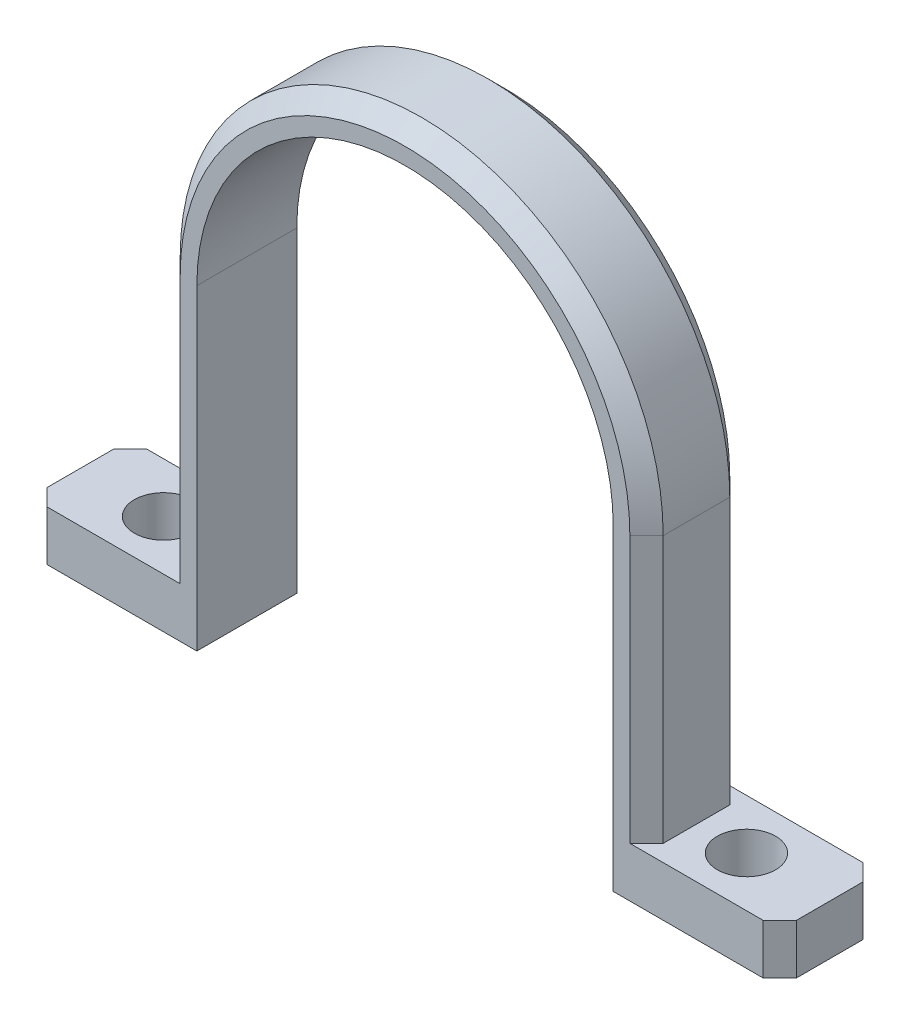
ISO-10303-21;
HEADER;
FILE_DESCRIPTION(('STEP AP214'),'2;1');
FILE_NAME('part.step','',(''),(''),'','','');
FILE_SCHEMA(('AUTOMOTIVE_DESIGN { 1 0 10303 214 1 1 1 1 }'));
ENDSEC;
DATA;
#1=APPLICATION_CONTEXT('core data for automotive mechanical design processes');
#2=APPLICATION_PROTOCOL_DEFINITION('international standard','automotive_design',2000,#1);
#3=PRODUCT_CONTEXT('',#1,'mechanical');
#4=PRODUCT('Part','Part','',(#3));
#5=PRODUCT_RELATED_PRODUCT_CATEGORY('part','',(#4));
#6=PRODUCT_DEFINITION_FORMATION('','',#4);
#7=PRODUCT_DEFINITION_CONTEXT('part definition',#1,'design');
#8=PRODUCT_DEFINITION('design','',#6,#7);
#9=PRODUCT_DEFINITION_SHAPE('','',#8);
#10=(LENGTH_UNIT() NAMED_UNIT(*) SI_UNIT(.MILLI.,.METRE.));
#11=(NAMED_UNIT(*) PLANE_ANGLE_UNIT() SI_UNIT($,.RADIAN.));
#12=(NAMED_UNIT(*) SI_UNIT($,.STERADIAN.) SOLID_ANGLE_UNIT());
#13=UNCERTAINTY_MEASURE_WITH_UNIT(LENGTH_MEASURE(1.E-05),#10,'distance_accuracy_value','');
#14=(GEOMETRIC_REPRESENTATION_CONTEXT(3) GLOBAL_UNCERTAINTY_ASSIGNED_CONTEXT((#13)) GLOBAL_UNIT_ASSIGNED_CONTEXT((#10,
#11,#12)) REPRESENTATION_CONTEXT('',''));
#15=CARTESIAN_POINT('',(0.,0.,0.));
#16=DIRECTION('',(0.,0.,1.));
#17=DIRECTION('',(1.,0.,0.));
#18=AXIS2_PLACEMENT_3D('',#15,#16,#17);
#19=CARTESIAN_POINT('',(0.,0.,6.));
#20=DIRECTION('',(0.,0.,-1.));
#21=DIRECTION('',(-1.,0.,0.));
#22=AXIS2_PLACEMENT_3D('',#19,#20,#21);
#23=CYLINDRICAL_SURFACE('',#22,14.5);
#24=DIRECTION('',(0.,0.,-1.));
#25=VECTOR('',#24,1.);
#26=CARTESIAN_POINT('',(14.5,0.,6.));
#27=LINE('',#26,#25);
#28=CARTESIAN_POINT('',(14.5,0.,5.));
#29=VERTEX_POINT('',#28);
#30=CARTESIAN_POINT('',(14.5,0.,1.00000000000001));
#31=VERTEX_POINT('',#30);
#32=EDGE_CURVE('E220',#29,#31,#27,.T.);
#33=ORIENTED_EDGE('',*,*,#32,.T.);
#34=CARTESIAN_POINT('',(0.,0.,1.00000000000001));
#35=DIRECTION('',(0.,0.,1.));
#36=DIRECTION('',(1.,0.,0.));
#37=AXIS2_PLACEMENT_3D('',#34,#35,#36);
#38=CIRCLE('',#37,14.5);
#39=CARTESIAN_POINT('',(-14.5,0.,1.00000000000001));
#40=VERTEX_POINT('',#39);
#41=EDGE_CURVE('E285',#31,#40,#38,.T.);
#42=ORIENTED_EDGE('',*,*,#41,.T.);
#43=DIRECTION('',(0.,0.,-1.));
#44=VECTOR('',#43,1.);
#45=CARTESIAN_POINT('',(-14.5,0.,6.));
#46=LINE('',#45,#44);
#47=CARTESIAN_POINT('',(-14.5,0.,5.));
#48=VERTEX_POINT('',#47);
#49=EDGE_CURVE('E260',#48,#40,#46,.T.);
#50=ORIENTED_EDGE('',*,*,#49,.F.);
#51=CARTESIAN_POINT('',(0.,0.,5.));
#52=DIRECTION('',(0.,0.,1.));
#53=DIRECTION('',(1.,0.,0.));
#54=AXIS2_PLACEMENT_3D('',#51,#52,#53);
#55=CIRCLE('',#54,14.5);
#56=EDGE_CURVE('E283',#48,#29,#55,.F.);
#57=ORIENTED_EDGE('',*,*,#56,.T.);
#58=EDGE_LOOP('',(#33,#42,#50,#57));
#59=FACE_BOUND('',#58,.T.);
#60=ADVANCED_FACE('F39',(#59),#23,.T.);
#61=CARTESIAN_POINT('',(-14.5,0.,6.));
#62=DIRECTION('',(1.,0.,0.));
#63=DIRECTION('',(0.,1.,0.));
#64=AXIS2_PLACEMENT_3D('',#61,#62,#63);
#65=PLANE('',#64);
#66=ORIENTED_EDGE('',*,*,#49,.T.);
#67=DIRECTION('',(0.,-1.,0.));
#68=VECTOR('',#67,1.);
#69=CARTESIAN_POINT('',(-14.5,0.,1.00000000000001));
#70=LINE('',#69,#68);
#71=CARTESIAN_POINT('',(-14.5,-16.,1.00000000000001));
#72=VERTEX_POINT('',#71);
#73=EDGE_CURVE('E269',#40,#72,#70,.T.);
#74=ORIENTED_EDGE('',*,*,#73,.T.);
#75=DIRECTION('',(0.,0.,-1.));
#76=VECTOR('',#75,1.);
#77=CARTESIAN_POINT('',(-14.5,-16.,6.));
#78=LINE('',#77,#76);
#79=CARTESIAN_POINT('',(-14.5,-16.,5.));
#80=VERTEX_POINT('',#79);
#81=EDGE_CURVE('E257',#80,#72,#78,.T.);
#82=ORIENTED_EDGE('',*,*,#81,.F.);
#83=DIRECTION('',(0.,1.,0.));
#84=VECTOR('',#83,1.);
#85=CARTESIAN_POINT('',(-14.5,0.,5.));
#86=LINE('',#85,#84);
#87=EDGE_CURVE('E263',#80,#48,#86,.T.);
#88=ORIENTED_EDGE('',*,*,#87,.T.);
#89=EDGE_LOOP('',(#66,#74,#82,#88));
#90=FACE_BOUND('',#89,.T.);
#91=ADVANCED_FACE('F373',(#90),#65,.F.);
#92=CARTESIAN_POINT('',(-14.5,-16.,6.));
#93=DIRECTION('',(0.,-1.,0.));
#94=DIRECTION('',(1.,0.,0.));
#95=AXIS2_PLACEMENT_3D('',#92,#93,#94);
#96=PLANE('',#95);
#97=CARTESIAN_POINT('',(-17.5,-16.,3.));
#98=DIRECTION('',(0.,-1.,0.));
#99=DIRECTION('',(1.,0.,0.));
#100=AXIS2_PLACEMENT_3D('',#97,#98,#99);
#101=CIRCLE('',#100,1.75);
#102=CARTESIAN_POINT('',(-15.75,-16.,3.));
#103=VERTEX_POINT('',#102);
#104=EDGE_CURVE('E223',#103,#103,#101,.T.);
#105=ORIENTED_EDGE('',*,*,#104,.T.);
#106=EDGE_LOOP('',(#105));
#107=FACE_BOUND('',#106,.T.);
#108=DIRECTION('',(-1.,0.,0.));
#109=VECTOR('',#108,1.);
#110=CARTESIAN_POINT('',(-14.5,-16.,0.));
#111=LINE('',#110,#109);
#112=CARTESIAN_POINT('',(-13.5,-16.,0.));
#113=VERTEX_POINT('',#112);
#114=CARTESIAN_POINT('',(-21.5,-16.,0.));
#115=VERTEX_POINT('',#114);
#116=EDGE_CURVE('E221',#113,#115,#111,.T.);
#117=ORIENTED_EDGE('',*,*,#116,.T.);
#118=DIRECTION('',(0.707106781186548,0.,-0.707106781186548));
#119=VECTOR('',#118,1.);
#120=CARTESIAN_POINT('',(-22.5,-16.,1.00000000000001));
#121=LINE('',#120,#119);
#122=CARTESIAN_POINT('',(-22.5,-16.,1.00000000000001));
#123=VERTEX_POINT('',#122);
#124=EDGE_CURVE('E57',#115,#123,#121,.F.);
#125=ORIENTED_EDGE('',*,*,#124,.T.);
#126=DIRECTION('',(0.,0.,-1.));
#127=VECTOR('',#126,1.);
#128=CARTESIAN_POINT('',(-22.5,-16.,6.));
#129=LINE('',#128,#127);
#130=CARTESIAN_POINT('',(-22.5,-16.,4.99999999999999));
#131=VERTEX_POINT('',#130);
#132=EDGE_CURVE('E255',#131,#123,#129,.T.);
#133=ORIENTED_EDGE('',*,*,#132,.F.);
#134=DIRECTION('',(0.707106781186548,0.,0.707106781186548));
#135=VECTOR('',#134,1.);
#136=CARTESIAN_POINT('',(-21.5,-16.,6.));
#137=LINE('',#136,#135);
#138=CARTESIAN_POINT('',(-21.5,-16.,6.));
#139=VERTEX_POINT('',#138);
#140=EDGE_CURVE('E322',#131,#139,#137,.T.);
#141=ORIENTED_EDGE('',*,*,#140,.T.);
#142=DIRECTION('',(-1.,0.,0.));
#143=VECTOR('',#142,1.);
#144=CARTESIAN_POINT('',(-14.5,-16.,6.));
#145=LINE('',#144,#143);
#146=CARTESIAN_POINT('',(-13.5,-16.,6.));
#147=VERTEX_POINT('',#146);
#148=EDGE_CURVE('E192',#147,#139,#145,.T.);
#149=ORIENTED_EDGE('',*,*,#148,.F.);
#150=DIRECTION('',(-0.707106781186548,0.,-0.707106781186548));
#151=VECTOR('',#150,1.);
#152=CARTESIAN_POINT('',(-14.,-16.,5.5));
#153=LINE('',#152,#151);
#154=EDGE_CURVE('E49',#147,#80,#153,.T.);
#155=ORIENTED_EDGE('',*,*,#154,.T.);
#156=ORIENTED_EDGE('',*,*,#81,.T.);
#157=DIRECTION('',(-0.707106781186548,0.,0.707106781186548));
#158=VECTOR('',#157,1.);
#159=CARTESIAN_POINT('',(-17.,-16.,3.5));
#160=LINE('',#159,#158);
#161=EDGE_CURVE('E325',#72,#113,#160,.F.);
#162=ORIENTED_EDGE('',*,*,#161,.T.);
#163=EDGE_LOOP('',(#117,#125,#133,#141,#149,#155,#156,#162));
#164=FACE_BOUND('',#163,.T.);
#165=ADVANCED_FACE('F382',(#107,#164),#96,.F.);
#166=CARTESIAN_POINT('',(-22.5,-16.,6.));
#167=DIRECTION('',(1.,0.,0.));
#168=DIRECTION('',(0.,0.,-1.));
#169=AXIS2_PLACEMENT_3D('',#166,#167,#168);
#170=PLANE('',#169);
#171=ORIENTED_EDGE('',*,*,#132,.T.);
#172=DIRECTION('',(0.,-1.,0.));
#173=VECTOR('',#172,1.);
#174=CARTESIAN_POINT('',(-22.5,-16.,1.00000000000001));
#175=LINE('',#174,#173);
#176=CARTESIAN_POINT('',(-22.5,-19.,1.00000000000001));
#177=VERTEX_POINT('',#176);
#178=EDGE_CURVE('E315',#123,#177,#175,.T.);
#179=ORIENTED_EDGE('',*,*,#178,.T.);
#180=DIRECTION('',(0.,0.,-1.));
#181=VECTOR('',#180,1.);
#182=CARTESIAN_POINT('',(-22.5,-19.,6.));
#183=LINE('',#182,#181);
#184=CARTESIAN_POINT('',(-22.5,-19.,4.99999999999999));
#185=VERTEX_POINT('',#184);
#186=EDGE_CURVE('E202',#185,#177,#183,.T.);
#187=ORIENTED_EDGE('',*,*,#186,.F.);
#188=DIRECTION('',(0.,1.,0.));
#189=VECTOR('',#188,1.);
#190=CARTESIAN_POINT('',(-22.5,-16.,4.99999999999999));
#191=LINE('',#190,#189);
#192=EDGE_CURVE('E64',#185,#131,#191,.T.);
#193=ORIENTED_EDGE('',*,*,#192,.T.);
#194=EDGE_LOOP('',(#171,#179,#187,#193));
#195=FACE_BOUND('',#194,.T.);
#196=ADVANCED_FACE('F635',(#195),#170,.F.);
#197=CARTESIAN_POINT('',(-12.5,-19.,6.));
#198=DIRECTION('',(0.,1.,0.));
#199=DIRECTION('',(-1.,0.,0.));
#200=AXIS2_PLACEMENT_3D('',#197,#198,#199);
#201=PLANE('',#200);
#202=CARTESIAN_POINT('',(-17.5,-19.,3.));
#203=DIRECTION('',(0.,-1.,0.));
#204=DIRECTION('',(1.,0.,0.));
#205=AXIS2_PLACEMENT_3D('',#202,#203,#204);
#206=CIRCLE('',#205,1.75);
#207=CARTESIAN_POINT('',(-15.75,-19.,3.));
#208=VERTEX_POINT('',#207);
#209=EDGE_CURVE('E267',#208,#208,#206,.T.);
#210=ORIENTED_EDGE('',*,*,#209,.F.);
#211=EDGE_LOOP('',(#210));
#212=FACE_BOUND('',#211,.T.);
#213=ORIENTED_EDGE('',*,*,#186,.T.);
#214=DIRECTION('',(-0.707106781186548,0.,0.707106781186548));
#215=VECTOR('',#214,1.);
#216=CARTESIAN_POINT('',(-22.5,-19.,1.00000000000001));
#217=LINE('',#216,#215);
#218=CARTESIAN_POINT('',(-21.5,-19.,0.));
#219=VERTEX_POINT('',#218);
#220=EDGE_CURVE('E320',#177,#219,#217,.F.);
#221=ORIENTED_EDGE('',*,*,#220,.T.);
#222=DIRECTION('',(1.,0.,0.));
#223=VECTOR('',#222,1.);
#224=CARTESIAN_POINT('',(-12.5,-19.,0.));
#225=LINE('',#224,#223);
#226=CARTESIAN_POINT('',(-12.5,-19.,0.));
#227=VERTEX_POINT('',#226);
#228=EDGE_CURVE('E199',#219,#227,#225,.T.);
#229=ORIENTED_EDGE('',*,*,#228,.T.);
#230=DIRECTION('',(0.,0.,-1.));
#231=VECTOR('',#230,1.);
#232=CARTESIAN_POINT('',(-12.5,-19.,6.));
#233=LINE('',#232,#231);
#234=CARTESIAN_POINT('',(-12.5,-19.,6.));
#235=VERTEX_POINT('',#234);
#236=EDGE_CURVE('E195',#235,#227,#233,.T.);
#237=ORIENTED_EDGE('',*,*,#236,.F.);
#238=DIRECTION('',(1.,0.,0.));
#239=VECTOR('',#238,1.);
#240=CARTESIAN_POINT('',(-12.5,-19.,6.));
#241=LINE('',#240,#239);
#242=CARTESIAN_POINT('',(-21.5,-19.,6.));
#243=VERTEX_POINT('',#242);
#244=EDGE_CURVE('E181',#243,#235,#241,.T.);
#245=ORIENTED_EDGE('',*,*,#244,.F.);
#246=DIRECTION('',(-0.707106781186548,0.,-0.707106781186548));
#247=VECTOR('',#246,1.);
#248=CARTESIAN_POINT('',(-21.5,-19.,6.));
#249=LINE('',#248,#247);
#250=EDGE_CURVE('E318',#243,#185,#249,.T.);
#251=ORIENTED_EDGE('',*,*,#250,.T.);
#252=EDGE_LOOP('',(#213,#221,#229,#237,#245,#251));
#253=FACE_BOUND('',#252,.T.);
#254=ADVANCED_FACE('F197',(#212,#253),#201,.F.);
#255=CARTESIAN_POINT('',(-12.5,0.,6.));
#256=DIRECTION('',(-1.,0.,0.));
#257=DIRECTION('',(0.,-1.,0.));
#258=AXIS2_PLACEMENT_3D('',#255,#256,#257);
#259=PLANE('',#258);
#260=DIRECTION('',(0.,1.,0.));
#261=VECTOR('',#260,1.);
#262=CARTESIAN_POINT('',(-12.5,0.,0.));
#263=LINE('',#262,#261);
#264=CARTESIAN_POINT('',(-12.5,0.,0.));
#265=VERTEX_POINT('',#264);
#266=EDGE_CURVE('E225',#227,#265,#263,.T.);
#267=ORIENTED_EDGE('',*,*,#266,.T.);
#268=DIRECTION('',(0.,0.,-1.));
#269=VECTOR('',#268,1.);
#270=CARTESIAN_POINT('',(-12.5,0.,6.));
#271=LINE('',#270,#269);
#272=CARTESIAN_POINT('',(-12.5,0.,6.));
#273=VERTEX_POINT('',#272);
#274=EDGE_CURVE('E203',#273,#265,#271,.T.);
#275=ORIENTED_EDGE('',*,*,#274,.F.);
#276=DIRECTION('',(0.,1.,0.));
#277=VECTOR('',#276,1.);
#278=CARTESIAN_POINT('',(-12.5,0.,6.));
#279=LINE('',#278,#277);
#280=EDGE_CURVE('E186',#235,#273,#279,.T.);
#281=ORIENTED_EDGE('',*,*,#280,.F.);
#282=ORIENTED_EDGE('',*,*,#236,.T.);
#283=EDGE_LOOP('',(#267,#275,#281,#282));
#284=FACE_BOUND('',#283,.T.);
#285=ADVANCED_FACE('F205',(#284),#259,.F.);
#286=CARTESIAN_POINT('',(0.,0.,6.));
#287=DIRECTION('',(0.,0.,-1.));
#288=DIRECTION('',(-1.,0.,0.));
#289=AXIS2_PLACEMENT_3D('',#286,#287,#288);
#290=CYLINDRICAL_SURFACE('',#289,12.5);
#291=CARTESIAN_POINT('',(0.,0.,0.));
#292=DIRECTION('',(0.,0.,-1.));
#293=DIRECTION('',(1.,0.,0.));
#294=AXIS2_PLACEMENT_3D('',#291,#292,#293);
#295=CIRCLE('',#294,12.5);
#296=CARTESIAN_POINT('',(12.5,0.,0.));
#297=VERTEX_POINT('',#296);
#298=EDGE_CURVE('E227',#265,#297,#295,.T.);
#299=ORIENTED_EDGE('',*,*,#298,.T.);
#300=DIRECTION('',(0.,0.,-1.));
#301=VECTOR('',#300,1.);
#302=CARTESIAN_POINT('',(12.5,0.,6.));
#303=LINE('',#302,#301);
#304=CARTESIAN_POINT('',(12.5,0.,6.));
#305=VERTEX_POINT('',#304);
#306=EDGE_CURVE('E250',#305,#297,#303,.T.);
#307=ORIENTED_EDGE('',*,*,#306,.F.);
#308=CARTESIAN_POINT('',(0.,0.,6.));
#309=DIRECTION('',(0.,0.,-1.));
#310=DIRECTION('',(1.,0.,0.));
#311=AXIS2_PLACEMENT_3D('',#308,#309,#310);
#312=CIRCLE('',#311,12.5);
#313=EDGE_CURVE('E208',#273,#305,#312,.T.);
#314=ORIENTED_EDGE('',*,*,#313,.F.);
#315=ORIENTED_EDGE('',*,*,#274,.T.);
#316=EDGE_LOOP('',(#299,#307,#314,#315));
#317=FACE_BOUND('',#316,.T.);
#318=ADVANCED_FACE('F609',(#317),#290,.F.);
#319=CARTESIAN_POINT('',(12.5,0.,6.));
#320=DIRECTION('',(1.,0.,0.));
#321=DIRECTION('',(0.,1.,0.));
#322=AXIS2_PLACEMENT_3D('',#319,#320,#321);
#323=PLANE('',#322);
#324=DIRECTION('',(0.,-1.,0.));
#325=VECTOR('',#324,1.);
#326=CARTESIAN_POINT('',(12.5,0.,0.));
#327=LINE('',#326,#325);
#328=CARTESIAN_POINT('',(12.5,-19.,0.));
#329=VERTEX_POINT('',#328);
#330=EDGE_CURVE('E229',#297,#329,#327,.T.);
#331=ORIENTED_EDGE('',*,*,#330,.T.);
#332=DIRECTION('',(0.,0.,-1.));
#333=VECTOR('',#332,1.);
#334=CARTESIAN_POINT('',(12.5,-19.,6.));
#335=LINE('',#334,#333);
#336=CARTESIAN_POINT('',(12.5,-19.,6.));
#337=VERTEX_POINT('',#336);
#338=EDGE_CURVE('E247',#337,#329,#335,.T.);
#339=ORIENTED_EDGE('',*,*,#338,.F.);
#340=DIRECTION('',(0.,-1.,0.));
#341=VECTOR('',#340,1.);
#342=CARTESIAN_POINT('',(12.5,0.,6.));
#343=LINE('',#342,#341);
#344=EDGE_CURVE('E210',#305,#337,#343,.T.);
#345=ORIENTED_EDGE('',*,*,#344,.F.);
#346=ORIENTED_EDGE('',*,*,#306,.T.);
#347=EDGE_LOOP('',(#331,#339,#345,#346));
#348=FACE_BOUND('',#347,.T.);
#349=ADVANCED_FACE('F402',(#348),#323,.F.);
#350=CARTESIAN_POINT('',(22.5,-19.,6.));
#351=DIRECTION('',(0.,1.,0.));
#352=DIRECTION('',(-1.,0.,0.));
#353=AXIS2_PLACEMENT_3D('',#350,#351,#352);
#354=PLANE('',#353);
#355=CARTESIAN_POINT('',(17.5,-19.,3.));
#356=DIRECTION('',(0.,-1.,0.));
#357=DIRECTION('',(1.,0.,0.));
#358=AXIS2_PLACEMENT_3D('',#355,#356,#357);
#359=CIRCLE('',#358,1.75);
#360=CARTESIAN_POINT('',(19.25,-19.,3.));
#361=VERTEX_POINT('',#360);
#362=EDGE_CURVE('E336',#361,#361,#359,.T.);
#363=ORIENTED_EDGE('',*,*,#362,.F.);
#364=EDGE_LOOP('',(#363));
#365=FACE_BOUND('',#364,.T.);
#366=DIRECTION('',(1.,0.,0.));
#367=VECTOR('',#366,1.);
#368=CARTESIAN_POINT('',(22.5,-19.,0.));
#369=LINE('',#368,#367);
#370=CARTESIAN_POINT('',(21.5,-19.,0.));
#371=VERTEX_POINT('',#370);
#372=EDGE_CURVE('E231',#329,#371,#369,.T.);
#373=ORIENTED_EDGE('',*,*,#372,.T.);
#374=DIRECTION('',(-0.707106781186548,0.,-0.707106781186548));
#375=VECTOR('',#374,1.);
#376=CARTESIAN_POINT('',(22.5,-19.,1.00000000000001));
#377=LINE('',#376,#375);
#378=CARTESIAN_POINT('',(22.5,-19.,1.00000000000001));
#379=VERTEX_POINT('',#378);
#380=EDGE_CURVE('E312',#371,#379,#377,.F.);
#381=ORIENTED_EDGE('',*,*,#380,.T.);
#382=DIRECTION('',(0.,0.,-1.));
#383=VECTOR('',#382,1.);
#384=CARTESIAN_POINT('',(22.5,-19.,6.));
#385=LINE('',#384,#383);
#386=CARTESIAN_POINT('',(22.5,-19.,4.99999999999999));
#387=VERTEX_POINT('',#386);
#388=EDGE_CURVE('E244',#387,#379,#385,.T.);
#389=ORIENTED_EDGE('',*,*,#388,.F.);
#390=DIRECTION('',(-0.707106781186548,0.,0.707106781186548));
#391=VECTOR('',#390,1.);
#392=CARTESIAN_POINT('',(21.5,-19.,6.));
#393=LINE('',#392,#391);
#394=CARTESIAN_POINT('',(21.5,-19.,6.));
#395=VERTEX_POINT('',#394);
#396=EDGE_CURVE('E310',#387,#395,#393,.T.);
#397=ORIENTED_EDGE('',*,*,#396,.T.);
#398=DIRECTION('',(1.,0.,0.));
#399=VECTOR('',#398,1.);
#400=CARTESIAN_POINT('',(22.5,-19.,6.));
#401=LINE('',#400,#399);
#402=EDGE_CURVE('E215',#337,#395,#401,.T.);
#403=ORIENTED_EDGE('',*,*,#402,.F.);
#404=ORIENTED_EDGE('',*,*,#338,.T.);
#405=EDGE_LOOP('',(#373,#381,#389,#397,#403,#404));
#406=FACE_BOUND('',#405,.T.);
#407=ADVANCED_FACE('F397',(#365,#406),#354,.F.);
#408=CARTESIAN_POINT('',(22.5,-16.,6.));
#409=DIRECTION('',(-1.,0.,0.));
#410=DIRECTION('',(0.,0.,1.));
#411=AXIS2_PLACEMENT_3D('',#408,#409,#410);
#412=PLANE('',#411);
#413=ORIENTED_EDGE('',*,*,#388,.T.);
#414=DIRECTION('',(0.,1.,0.));
#415=VECTOR('',#414,1.);
#416=CARTESIAN_POINT('',(22.5,-16.,1.00000000000001));
#417=LINE('',#416,#415);
#418=CARTESIAN_POINT('',(22.5,-16.,1.00000000000001));
#419=VERTEX_POINT('',#418);
#420=EDGE_CURVE('E303',#379,#419,#417,.T.);
#421=ORIENTED_EDGE('',*,*,#420,.T.);
#422=DIRECTION('',(0.,0.,-1.));
#423=VECTOR('',#422,1.);
#424=CARTESIAN_POINT('',(22.5,-16.,6.));
#425=LINE('',#424,#423);
#426=CARTESIAN_POINT('',(22.5,-16.,4.99999999999999));
#427=VERTEX_POINT('',#426);
#428=EDGE_CURVE('E241',#427,#419,#425,.T.);
#429=ORIENTED_EDGE('',*,*,#428,.F.);
#430=DIRECTION('',(0.,-1.,0.));
#431=VECTOR('',#430,1.);
#432=CARTESIAN_POINT('',(22.5,-19.,4.99999999999999));
#433=LINE('',#432,#431);
#434=EDGE_CURVE('E301',#427,#387,#433,.T.);
#435=ORIENTED_EDGE('',*,*,#434,.T.);
#436=EDGE_LOOP('',(#413,#421,#429,#435));
#437=FACE_BOUND('',#436,.T.);
#438=ADVANCED_FACE('F390',(#437),#412,.F.);
#439=CARTESIAN_POINT('',(14.5,-16.,6.));
#440=DIRECTION('',(0.,-1.,0.));
#441=DIRECTION('',(1.,0.,0.));
#442=AXIS2_PLACEMENT_3D('',#439,#440,#441);
#443=PLANE('',#442);
#444=CARTESIAN_POINT('',(17.5,-16.,3.));
#445=DIRECTION('',(0.,-1.,0.));
#446=DIRECTION('',(1.,0.,0.));
#447=AXIS2_PLACEMENT_3D('',#444,#445,#446);
#448=CIRCLE('',#447,1.75);
#449=CARTESIAN_POINT('',(19.25,-16.,3.));
#450=VERTEX_POINT('',#449);
#451=EDGE_CURVE('E264',#450,#450,#448,.T.);
#452=ORIENTED_EDGE('',*,*,#451,.T.);
#453=EDGE_LOOP('',(#452));
#454=FACE_BOUND('',#453,.T.);
#455=ORIENTED_EDGE('',*,*,#428,.T.);
#456=DIRECTION('',(0.707106781186548,0.,0.707106781186548));
#457=VECTOR('',#456,1.);
#458=CARTESIAN_POINT('',(22.5,-16.,1.00000000000001));
#459=LINE('',#458,#457);
#460=CARTESIAN_POINT('',(21.5,-16.,0.));
#461=VERTEX_POINT('',#460);
#462=EDGE_CURVE('E308',#419,#461,#459,.F.);
#463=ORIENTED_EDGE('',*,*,#462,.T.);
#464=DIRECTION('',(-1.,0.,0.));
#465=VECTOR('',#464,1.);
#466=CARTESIAN_POINT('',(14.5,-16.,0.));
#467=LINE('',#466,#465);
#468=CARTESIAN_POINT('',(13.5,-16.,0.));
#469=VERTEX_POINT('',#468);
#470=EDGE_CURVE('E234',#461,#469,#467,.T.);
#471=ORIENTED_EDGE('',*,*,#470,.T.);
#472=DIRECTION('',(-0.707106781186548,0.,-0.707106781186548));
#473=VECTOR('',#472,1.);
#474=CARTESIAN_POINT('',(17.,-16.,3.5));
#475=LINE('',#474,#473);
#476=CARTESIAN_POINT('',(14.5,-16.,1.00000000000001));
#477=VERTEX_POINT('',#476);
#478=EDGE_CURVE('E328',#469,#477,#475,.F.);
#479=ORIENTED_EDGE('',*,*,#478,.T.);
#480=DIRECTION('',(0.,0.,-1.));
#481=VECTOR('',#480,1.);
#482=CARTESIAN_POINT('',(14.5,-16.,6.));
#483=LINE('',#482,#481);
#484=CARTESIAN_POINT('',(14.5,-16.,5.));
#485=VERTEX_POINT('',#484);
#486=EDGE_CURVE('E238',#485,#477,#483,.T.);
#487=ORIENTED_EDGE('',*,*,#486,.F.);
#488=DIRECTION('',(-0.707106781186548,0.,0.707106781186548));
#489=VECTOR('',#488,1.);
#490=CARTESIAN_POINT('',(14.,-16.,5.5));
#491=LINE('',#490,#489);
#492=CARTESIAN_POINT('',(13.5,-16.,6.));
#493=VERTEX_POINT('',#492);
#494=EDGE_CURVE('E11',#485,#493,#491,.T.);
#495=ORIENTED_EDGE('',*,*,#494,.T.);
#496=DIRECTION('',(-1.,0.,0.));
#497=VECTOR('',#496,1.);
#498=CARTESIAN_POINT('',(14.5,-16.,6.));
#499=LINE('',#498,#497);
#500=CARTESIAN_POINT('',(21.5,-16.,6.));
#501=VERTEX_POINT('',#500);
#502=EDGE_CURVE('E218',#501,#493,#499,.T.);
#503=ORIENTED_EDGE('',*,*,#502,.F.);
#504=DIRECTION('',(0.707106781186548,0.,-0.707106781186548));
#505=VECTOR('',#504,1.);
#506=CARTESIAN_POINT('',(21.5,-16.,6.));
#507=LINE('',#506,#505);
#508=EDGE_CURVE('E306',#501,#427,#507,.T.);
#509=ORIENTED_EDGE('',*,*,#508,.T.);
#510=EDGE_LOOP('',(#455,#463,#471,#479,#487,#495,#503,#509));
#511=FACE_BOUND('',#510,.T.);
#512=ADVANCED_FACE('F360',(#454,#511),#443,.F.);
#513=CARTESIAN_POINT('',(14.5,0.,6.));
#514=DIRECTION('',(-1.,0.,0.));
#515=DIRECTION('',(0.,-1.,0.));
#516=AXIS2_PLACEMENT_3D('',#513,#514,#515);
#517=PLANE('',#516);
#518=ORIENTED_EDGE('',*,*,#486,.T.);
#519=DIRECTION('',(0.,1.,0.));
#520=VECTOR('',#519,1.);
#521=CARTESIAN_POINT('',(14.5,0.,1.00000000000001));
#522=LINE('',#521,#520);
#523=EDGE_CURVE('E289',#477,#31,#522,.T.);
#524=ORIENTED_EDGE('',*,*,#523,.T.);
#525=ORIENTED_EDGE('',*,*,#32,.F.);
#526=DIRECTION('',(0.,-1.,0.));
#527=VECTOR('',#526,1.);
#528=CARTESIAN_POINT('',(14.5,-16.,5.));
#529=LINE('',#528,#527);
#530=EDGE_CURVE('E287',#29,#485,#529,.T.);
#531=ORIENTED_EDGE('',*,*,#530,.T.);
#532=EDGE_LOOP('',(#518,#524,#525,#531));
#533=FACE_BOUND('',#532,.T.);
#534=ADVANCED_FACE('F357',(#533),#517,.F.);
#535=CARTESIAN_POINT('',(0.,0.,6.));
#536=DIRECTION('',(0.,0.,1.));
#537=DIRECTION('',(1.,0.,0.));
#538=AXIS2_PLACEMENT_3D('',#535,#536,#537);
#539=PLANE('',#538);
#540=DIRECTION('',(0.,-1.,0.));
#541=VECTOR('',#540,1.);
#542=CARTESIAN_POINT('',(-13.5,-16.,6.));
#543=LINE('',#542,#541);
#544=CARTESIAN_POINT('',(-13.5,0.,6.));
#545=VERTEX_POINT('',#544);
#546=EDGE_CURVE('E299',#545,#147,#543,.T.);
#547=ORIENTED_EDGE('',*,*,#546,.T.);
#548=ORIENTED_EDGE('',*,*,#148,.T.);
#549=DIRECTION('',(0.,-1.,0.));
#550=VECTOR('',#549,1.);
#551=CARTESIAN_POINT('',(-21.5,-19.,6.));
#552=LINE('',#551,#550);
#553=EDGE_CURVE('E190',#139,#243,#552,.T.);
#554=ORIENTED_EDGE('',*,*,#553,.T.);
#555=ORIENTED_EDGE('',*,*,#244,.T.);
#556=ORIENTED_EDGE('',*,*,#280,.T.);
#557=ORIENTED_EDGE('',*,*,#313,.T.);
#558=ORIENTED_EDGE('',*,*,#344,.T.);
#559=ORIENTED_EDGE('',*,*,#402,.T.);
#560=DIRECTION('',(0.,1.,0.));
#561=VECTOR('',#560,1.);
#562=CARTESIAN_POINT('',(21.5,-16.,6.));
#563=LINE('',#562,#561);
#564=EDGE_CURVE('E292',#395,#501,#563,.T.);
#565=ORIENTED_EDGE('',*,*,#564,.T.);
#566=ORIENTED_EDGE('',*,*,#502,.T.);
#567=DIRECTION('',(0.,1.,0.));
#568=VECTOR('',#567,1.);
#569=CARTESIAN_POINT('',(13.5,0.,6.));
#570=LINE('',#569,#568);
#571=CARTESIAN_POINT('',(13.5,0.,6.));
#572=VERTEX_POINT('',#571);
#573=EDGE_CURVE('E295',#493,#572,#570,.T.);
#574=ORIENTED_EDGE('',*,*,#573,.T.);
#575=CARTESIAN_POINT('',(0.,0.,6.));
#576=DIRECTION('',(0.,0.,1.));
#577=DIRECTION('',(1.,0.,0.));
#578=AXIS2_PLACEMENT_3D('',#575,#576,#577);
#579=CIRCLE('',#578,13.5);
#580=EDGE_CURVE('E297',#572,#545,#579,.T.);
#581=ORIENTED_EDGE('',*,*,#580,.T.);
#582=EDGE_LOOP('',(#547,#548,#554,#555,#556,#557,#558,#559,#565,#566,#574,#581));
#583=FACE_BOUND('',#582,.T.);
#584=ADVANCED_FACE('F184',(#583),#539,.T.);
#585=CARTESIAN_POINT('',(0.,0.,0.));
#586=DIRECTION('',(0.,0.,1.));
#587=DIRECTION('',(1.,0.,0.));
#588=AXIS2_PLACEMENT_3D('',#585,#586,#587);
#589=PLANE('',#588);
#590=ORIENTED_EDGE('',*,*,#116,.F.);
#591=DIRECTION('',(0.,1.,0.));
#592=VECTOR('',#591,1.);
#593=CARTESIAN_POINT('',(-13.5,0.,0.));
#594=LINE('',#593,#592);
#595=CARTESIAN_POINT('',(-13.5,0.,0.));
#596=VERTEX_POINT('',#595);
#597=EDGE_CURVE('E281',#113,#596,#594,.T.);
#598=ORIENTED_EDGE('',*,*,#597,.T.);
#599=CARTESIAN_POINT('',(0.,0.,0.));
#600=DIRECTION('',(0.,0.,1.));
#601=DIRECTION('',(1.,0.,0.));
#602=AXIS2_PLACEMENT_3D('',#599,#600,#601);
#603=CIRCLE('',#602,13.5);
#604=CARTESIAN_POINT('',(13.5,0.,0.));
#605=VERTEX_POINT('',#604);
#606=EDGE_CURVE('E279',#596,#605,#603,.F.);
#607=ORIENTED_EDGE('',*,*,#606,.T.);
#608=DIRECTION('',(0.,-1.,0.));
#609=VECTOR('',#608,1.);
#610=CARTESIAN_POINT('',(13.5,0.,0.));
#611=LINE('',#610,#609);
#612=EDGE_CURVE('E276',#605,#469,#611,.T.);
#613=ORIENTED_EDGE('',*,*,#612,.T.);
#614=ORIENTED_EDGE('',*,*,#470,.F.);
#615=DIRECTION('',(0.,-1.,0.));
#616=VECTOR('',#615,1.);
#617=CARTESIAN_POINT('',(21.5,0.,0.));
#618=LINE('',#617,#616);
#619=EDGE_CURVE('E274',#461,#371,#618,.T.);
#620=ORIENTED_EDGE('',*,*,#619,.T.);
#621=ORIENTED_EDGE('',*,*,#372,.F.);
#622=ORIENTED_EDGE('',*,*,#330,.F.);
#623=ORIENTED_EDGE('',*,*,#298,.F.);
#624=ORIENTED_EDGE('',*,*,#266,.F.);
#625=ORIENTED_EDGE('',*,*,#228,.F.);
#626=DIRECTION('',(0.,1.,0.));
#627=VECTOR('',#626,1.);
#628=CARTESIAN_POINT('',(-21.5,0.,0.));
#629=LINE('',#628,#627);
#630=EDGE_CURVE('E272',#219,#115,#629,.T.);
#631=ORIENTED_EDGE('',*,*,#630,.T.);
#632=EDGE_LOOP('',(#590,#598,#607,#613,#614,#620,#621,#622,#623,#624,#625,#631));
#633=FACE_BOUND('',#632,.T.);
#634=ADVANCED_FACE('F407',(#633),#589,.F.);
#635=CARTESIAN_POINT('',(17.5,14.5,3.));
#636=DIRECTION('',(0.,-1.,0.));
#637=DIRECTION('',(1.,0.,0.));
#638=AXIS2_PLACEMENT_3D('',#635,#636,#637);
#639=CYLINDRICAL_SURFACE('',#638,1.75);
#640=ORIENTED_EDGE('',*,*,#362,.T.);
#641=EDGE_LOOP('',(#640));
#642=FACE_BOUND('',#641,.T.);
#643=ORIENTED_EDGE('',*,*,#451,.F.);
#644=EDGE_LOOP('',(#643));
#645=FACE_BOUND('',#644,.T.);
#646=ADVANCED_FACE('F541',(#642,#645),#639,.F.);
#647=CARTESIAN_POINT('',(-17.5,14.5,3.));
#648=DIRECTION('',(0.,-1.,0.));
#649=DIRECTION('',(1.,0.,0.));
#650=AXIS2_PLACEMENT_3D('',#647,#648,#649);
#651=CYLINDRICAL_SURFACE('',#650,1.75);
#652=ORIENTED_EDGE('',*,*,#209,.T.);
#653=EDGE_LOOP('',(#652));
#654=FACE_BOUND('',#653,.T.);
#655=ORIENTED_EDGE('',*,*,#104,.F.);
#656=EDGE_LOOP('',(#655));
#657=FACE_BOUND('',#656,.T.);
#658=ADVANCED_FACE('F447',(#654,#657),#651,.F.);
#659=CARTESIAN_POINT('',(14.5,0.,1.00000000000001));
#660=DIRECTION('',(-0.707106781186547,0.,0.707106781186547));
#661=DIRECTION('',(0.,1.,0.));
#662=AXIS2_PLACEMENT_3D('',#659,#660,#661);
#663=PLANE('',#662);
#664=ORIENTED_EDGE('',*,*,#478,.F.);
#665=ORIENTED_EDGE('',*,*,#612,.F.);
#666=DIRECTION('',(-0.707106781186547,0.,-0.707106781186547));
#667=VECTOR('',#666,1.);
#668=CARTESIAN_POINT('',(14.5,0.,1.00000000000001));
#669=LINE('',#668,#667);
#670=EDGE_CURVE('E334',#31,#605,#669,.T.);
#671=ORIENTED_EDGE('',*,*,#670,.F.);
#672=ORIENTED_EDGE('',*,*,#523,.F.);
#673=EDGE_LOOP('',(#664,#665,#671,#672));
#674=FACE_BOUND('',#673,.T.);
#675=ADVANCED_FACE('F366',(#674),#663,.F.);
#676=CARTESIAN_POINT('',(0.,0.,1.00000000000001));
#677=DIRECTION('',(0.,0.,1.));
#678=DIRECTION('',(1.,0.,0.));
#679=AXIS2_PLACEMENT_3D('',#676,#677,#678);
#680=CONICAL_SURFACE('',#679,14.5,0.785398163397448);
#681=ORIENTED_EDGE('',*,*,#670,.T.);
#682=ORIENTED_EDGE('',*,*,#606,.F.);
#683=DIRECTION('',(0.707106781186547,0.,-0.707106781186547));
#684=VECTOR('',#683,1.);
#685=CARTESIAN_POINT('',(-14.5,0.,1.00000000000001));
#686=LINE('',#685,#684);
#687=EDGE_CURVE('E331',#40,#596,#686,.T.);
#688=ORIENTED_EDGE('',*,*,#687,.F.);
#689=ORIENTED_EDGE('',*,*,#41,.F.);
#690=EDGE_LOOP('',(#681,#682,#688,#689));
#691=FACE_BOUND('',#690,.T.);
#692=ADVANCED_FACE('F378',(#691),#680,.T.);
#693=CARTESIAN_POINT('',(-14.5,0.,1.00000000000001));
#694=DIRECTION('',(0.707106781186547,0.,0.707106781186547));
#695=DIRECTION('',(0.,-1.,0.));
#696=AXIS2_PLACEMENT_3D('',#693,#694,#695);
#697=PLANE('',#696);
#698=ORIENTED_EDGE('',*,*,#687,.T.);
#699=ORIENTED_EDGE('',*,*,#597,.F.);
#700=ORIENTED_EDGE('',*,*,#161,.F.);
#701=ORIENTED_EDGE('',*,*,#73,.F.);
#702=EDGE_LOOP('',(#698,#699,#700,#701));
#703=FACE_BOUND('',#702,.T.);
#704=ADVANCED_FACE('F381',(#703),#697,.F.);
#705=CARTESIAN_POINT('',(13.5,0.,6.));
#706=DIRECTION('',(0.707106781186547,0.,0.707106781186547));
#707=DIRECTION('',(0.,-1.,0.));
#708=AXIS2_PLACEMENT_3D('',#705,#706,#707);
#709=PLANE('',#708);
#710=ORIENTED_EDGE('',*,*,#494,.F.);
#711=ORIENTED_EDGE('',*,*,#530,.F.);
#712=DIRECTION('',(0.707106781186547,0.,-0.707106781186547));
#713=VECTOR('',#712,1.);
#714=CARTESIAN_POINT('',(13.5,0.,6.));
#715=LINE('',#714,#713);
#716=EDGE_CURVE('E44',#572,#29,#715,.T.);
#717=ORIENTED_EDGE('',*,*,#716,.F.);
#718=ORIENTED_EDGE('',*,*,#573,.F.);
#719=EDGE_LOOP('',(#710,#711,#717,#718));
#720=FACE_BOUND('',#719,.T.);
#721=ADVANCED_FACE('F353',(#720),#709,.T.);
#722=CARTESIAN_POINT('',(0.,0.,6.));
#723=DIRECTION('',(0.,0.,-1.));
#724=DIRECTION('',(-1.,0.,0.));
#725=AXIS2_PLACEMENT_3D('',#722,#723,#724);
#726=CONICAL_SURFACE('',#725,13.5,0.785398163397448);
#727=ORIENTED_EDGE('',*,*,#716,.T.);
#728=ORIENTED_EDGE('',*,*,#56,.F.);
#729=DIRECTION('',(-0.707106781186547,0.,-0.707106781186547));
#730=VECTOR('',#729,1.);
#731=CARTESIAN_POINT('',(-13.5,0.,6.));
#732=LINE('',#731,#730);
#733=EDGE_CURVE('E337',#545,#48,#732,.T.);
#734=ORIENTED_EDGE('',*,*,#733,.F.);
#735=ORIENTED_EDGE('',*,*,#580,.F.);
#736=EDGE_LOOP('',(#727,#728,#734,#735));
#737=FACE_BOUND('',#736,.T.);
#738=ADVANCED_FACE('F348',(#737),#726,.T.);
#739=CARTESIAN_POINT('',(-13.5,0.,6.));
#740=DIRECTION('',(-0.707106781186547,0.,0.707106781186547));
#741=DIRECTION('',(0.,1.,0.));
#742=AXIS2_PLACEMENT_3D('',#739,#740,#741);
#743=PLANE('',#742);
#744=ORIENTED_EDGE('',*,*,#733,.T.);
#745=ORIENTED_EDGE('',*,*,#87,.F.);
#746=ORIENTED_EDGE('',*,*,#154,.F.);
#747=ORIENTED_EDGE('',*,*,#546,.F.);
#748=EDGE_LOOP('',(#744,#745,#746,#747));
#749=FACE_BOUND('',#748,.T.);
#750=ADVANCED_FACE('F384',(#749),#743,.T.);
#751=CARTESIAN_POINT('',(22.5,-16.,1.00000000000001));
#752=DIRECTION('',(-0.707106781186547,0.,0.707106781186547));
#753=DIRECTION('',(0.,1.,0.));
#754=AXIS2_PLACEMENT_3D('',#751,#752,#753);
#755=PLANE('',#754);
#756=ORIENTED_EDGE('',*,*,#380,.F.);
#757=ORIENTED_EDGE('',*,*,#619,.F.);
#758=ORIENTED_EDGE('',*,*,#462,.F.);
#759=ORIENTED_EDGE('',*,*,#420,.F.);
#760=EDGE_LOOP('',(#756,#757,#758,#759));
#761=FACE_BOUND('',#760,.T.);
#762=ADVANCED_FACE('F411',(#761),#755,.F.);
#763=CARTESIAN_POINT('',(21.5,0.,6.));
#764=DIRECTION('',(0.707106781186547,0.,0.707106781186547));
#765=DIRECTION('',(0.,-1.,0.));
#766=AXIS2_PLACEMENT_3D('',#763,#764,#765);
#767=PLANE('',#766);
#768=ORIENTED_EDGE('',*,*,#396,.F.);
#769=ORIENTED_EDGE('',*,*,#434,.F.);
#770=ORIENTED_EDGE('',*,*,#508,.F.);
#771=ORIENTED_EDGE('',*,*,#564,.F.);
#772=EDGE_LOOP('',(#768,#769,#770,#771));
#773=FACE_BOUND('',#772,.T.);
#774=ADVANCED_FACE('F394',(#773),#767,.T.);
#775=CARTESIAN_POINT('',(-22.5,-16.,1.00000000000001));
#776=DIRECTION('',(0.707106781186547,0.,0.707106781186547));
#777=DIRECTION('',(0.,-1.,0.));
#778=AXIS2_PLACEMENT_3D('',#775,#776,#777);
#779=PLANE('',#778);
#780=ORIENTED_EDGE('',*,*,#124,.F.);
#781=ORIENTED_EDGE('',*,*,#630,.F.);
#782=ORIENTED_EDGE('',*,*,#220,.F.);
#783=ORIENTED_EDGE('',*,*,#178,.F.);
#784=EDGE_LOOP('',(#780,#781,#782,#783));
#785=FACE_BOUND('',#784,.T.);
#786=ADVANCED_FACE('F418',(#785),#779,.F.);
#787=CARTESIAN_POINT('',(-21.5,0.,6.));
#788=DIRECTION('',(-0.707106781186547,0.,0.707106781186547));
#789=DIRECTION('',(0.,1.,0.));
#790=AXIS2_PLACEMENT_3D('',#787,#788,#789);
#791=PLANE('',#790);
#792=ORIENTED_EDGE('',*,*,#140,.F.);
#793=ORIENTED_EDGE('',*,*,#192,.F.);
#794=ORIENTED_EDGE('',*,*,#250,.F.);
#795=ORIENTED_EDGE('',*,*,#553,.F.);
#796=EDGE_LOOP('',(#792,#793,#794,#795));
#797=FACE_BOUND('',#796,.T.);
#798=ADVANCED_FACE('F42',(#797),#791,.T.);
#799=CLOSED_SHELL('',(#60,#91,#165,#196,#254,#285,#318,#349,#407,#438,#512,#534,#584,#634,#646,
#658,#675,#692,#704,#721,#738,#750,#762,#774,#786,#798));
#800=MANIFOLD_SOLID_BREP('B2',#799);
#801=ADVANCED_BREP_SHAPE_REPRESENTATION('',(#18,#800),#14);
#802=SHAPE_DEFINITION_REPRESENTATION(#9,#801);
ENDSEC;
END-ISO-10303-21;
